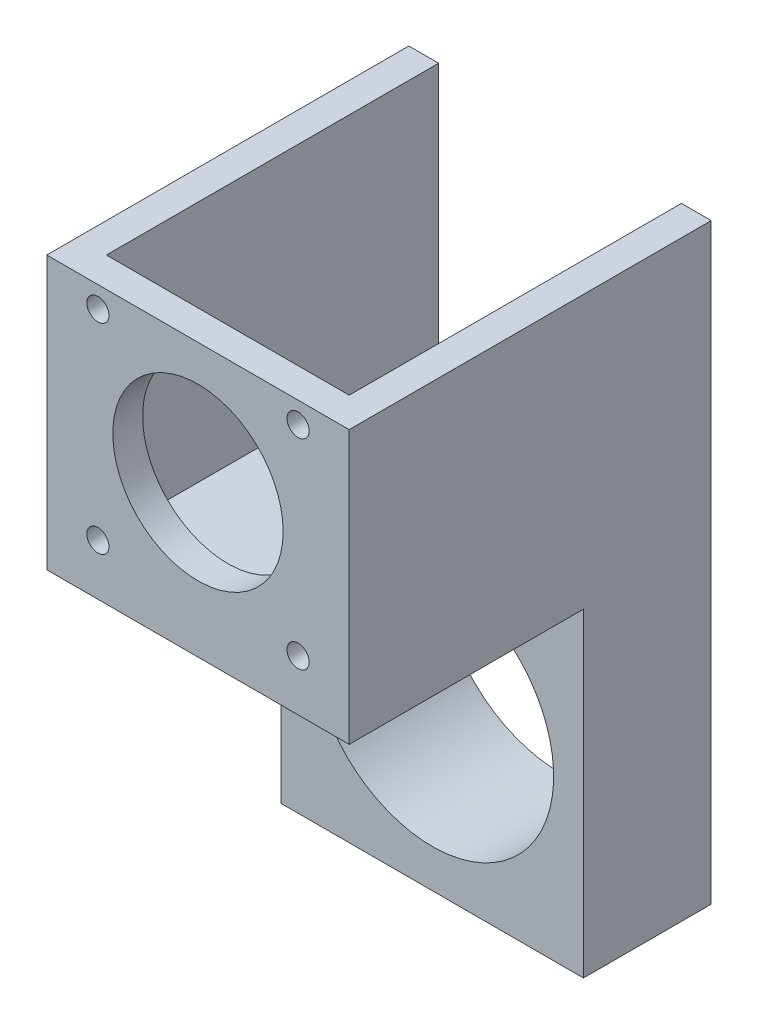
ISO-10303-21;
HEADER;
FILE_DESCRIPTION(('STEP AP214'),'2;1');
FILE_NAME('part.step','',(''),(''),'','','');
FILE_SCHEMA(('AUTOMOTIVE_DESIGN { 1 0 10303 214 1 1 1 1 }'));
ENDSEC;
DATA;
#1=APPLICATION_CONTEXT('core data for automotive mechanical design processes');
#2=APPLICATION_PROTOCOL_DEFINITION('international standard','automotive_design',2000,#1);
#3=PRODUCT_CONTEXT('',#1,'mechanical');
#4=PRODUCT('Part','Part','',(#3));
#5=PRODUCT_RELATED_PRODUCT_CATEGORY('part','',(#4));
#6=PRODUCT_DEFINITION_FORMATION('','',#4);
#7=PRODUCT_DEFINITION_CONTEXT('part definition',#1,'design');
#8=PRODUCT_DEFINITION('design','',#6,#7);
#9=PRODUCT_DEFINITION_SHAPE('','',#8);
#10=(LENGTH_UNIT() NAMED_UNIT(*) SI_UNIT(.MILLI.,.METRE.));
#11=(NAMED_UNIT(*) PLANE_ANGLE_UNIT() SI_UNIT($,.RADIAN.));
#12=(NAMED_UNIT(*) SI_UNIT($,.STERADIAN.) SOLID_ANGLE_UNIT());
#13=UNCERTAINTY_MEASURE_WITH_UNIT(LENGTH_MEASURE(1.E-05),#10,'distance_accuracy_value','');
#14=(GEOMETRIC_REPRESENTATION_CONTEXT(3) GLOBAL_UNCERTAINTY_ASSIGNED_CONTEXT((#13)) GLOBAL_UNIT_ASSIGNED_CONTEXT((#10,
#11,#12)) REPRESENTATION_CONTEXT('',''));
#15=CARTESIAN_POINT('',(0.,0.,0.));
#16=DIRECTION('',(0.,0.,1.));
#17=DIRECTION('',(1.,0.,0.));
#18=AXIS2_PLACEMENT_3D('',#15,#16,#17);
#19=CARTESIAN_POINT('',(0.,0.99999999999996,-68.));
#20=DIRECTION('',(0.,-1.,0.));
#21=DIRECTION('',(0.,0.,-1.));
#22=AXIS2_PLACEMENT_3D('',#19,#20,#21);
#23=PLANE('',#22);
#24=DIRECTION('',(0.,0.,1.));
#25=VECTOR('',#24,1.);
#26=CARTESIAN_POINT('',(-88.297129583773,0.99999999999996,-68.));
#27=LINE('',#26,#25);
#28=CARTESIAN_POINT('',(-88.297129583773,0.99999999999996,-48.));
#29=VERTEX_POINT('',#28);
#30=CARTESIAN_POINT('',(-88.297129583773,0.99999999999996,7.));
#31=VERTEX_POINT('',#30);
#32=EDGE_CURVE('E54',#29,#31,#27,.T.);
#33=ORIENTED_EDGE('',*,*,#32,.F.);
#34=DIRECTION('',(1.,0.,0.));
#35=VECTOR('',#34,1.);
#36=CARTESIAN_POINT('',(0.,0.99999999999996,-48.));
#37=LINE('',#36,#35);
#38=CARTESIAN_POINT('',(-17.297129583773,0.99999999999996,-48.));
#39=VERTEX_POINT('',#38);
#40=EDGE_CURVE('E49',#29,#39,#37,.T.);
#41=ORIENTED_EDGE('',*,*,#40,.T.);
#42=DIRECTION('',(0.,0.,1.));
#43=VECTOR('',#42,1.);
#44=CARTESIAN_POINT('',(-17.297129583773,0.99999999999996,-68.));
#45=LINE('',#44,#43);
#46=CARTESIAN_POINT('',(-17.297129583773,0.99999999999996,7.));
#47=VERTEX_POINT('',#46);
#48=EDGE_CURVE('E180',#39,#47,#45,.T.);
#49=ORIENTED_EDGE('',*,*,#48,.T.);
#50=DIRECTION('',(1.,0.,0.));
#51=VECTOR('',#50,1.);
#52=CARTESIAN_POINT('',(0.,0.99999999999996,7.));
#53=LINE('',#52,#51);
#54=EDGE_CURVE('E173',#31,#47,#53,.T.);
#55=ORIENTED_EDGE('',*,*,#54,.F.);
#56=EDGE_LOOP('',(#33,#41,#49,#55));
#57=FACE_BOUND('',#56,.T.);
#58=ADVANCED_FACE('F33',(#57),#23,.T.);
#59=CARTESIAN_POINT('',(0.,0.,7.));
#60=DIRECTION('',(0.,0.,1.));
#61=DIRECTION('',(1.,0.,0.));
#62=AXIS2_PLACEMENT_3D('',#59,#60,#61);
#63=PLANE('',#62);
#64=CARTESIAN_POINT('',(-52.7971295837729,36.5000000000001,7.));
#65=DIRECTION('',(0.,0.,1.));
#66=DIRECTION('',(1.,0.,0.));
#67=AXIS2_PLACEMENT_3D('',#64,#65,#66);
#68=CIRCLE('',#67,20.);
#69=CARTESIAN_POINT('',(-32.7971295837729,36.5000000000001,7.));
#70=VERTEX_POINT('',#69);
#71=EDGE_CURVE('E179',#70,#70,#68,.T.);
#72=ORIENTED_EDGE('',*,*,#71,.F.);
#73=EDGE_LOOP('',(#72));
#74=FACE_BOUND('',#73,.T.);
#75=CARTESIAN_POINT('',(-29.297129583773,60.,7.));
#76=DIRECTION('',(0.,0.,1.));
#77=DIRECTION('',(1.,0.,0.));
#78=AXIS2_PLACEMENT_3D('',#75,#76,#77);
#79=CIRCLE('',#78,2.60000000002528);
#80=CARTESIAN_POINT('',(-26.6971295837477,60.,7.));
#81=VERTEX_POINT('',#80);
#82=EDGE_CURVE('E202',#81,#81,#79,.T.);
#83=ORIENTED_EDGE('',*,*,#82,.F.);
#84=EDGE_LOOP('',(#83));
#85=FACE_BOUND('',#84,.T.);
#86=CARTESIAN_POINT('',(-76.2971295837732,13.0000000000002,7.));
#87=DIRECTION('',(0.,0.,1.));
#88=DIRECTION('',(1.,0.,0.));
#89=AXIS2_PLACEMENT_3D('',#86,#87,#88);
#90=CIRCLE('',#89,2.60000000001845);
#91=CARTESIAN_POINT('',(-73.6971295837547,13.0000000000002,7.));
#92=VERTEX_POINT('',#91);
#93=EDGE_CURVE('E214',#92,#92,#90,.T.);
#94=ORIENTED_EDGE('',*,*,#93,.F.);
#95=EDGE_LOOP('',(#94));
#96=FACE_BOUND('',#95,.T.);
#97=DIRECTION('',(-1.,0.,0.));
#98=VECTOR('',#97,1.);
#99=CARTESIAN_POINT('',(-24.297129583773,65.,7.));
#100=LINE('',#99,#98);
#101=CARTESIAN_POINT('',(-17.297129583773,65.,7.));
#102=VERTEX_POINT('',#101);
#103=CARTESIAN_POINT('',(-88.297129583773,65.,7.));
#104=VERTEX_POINT('',#103);
#105=EDGE_CURVE('E11',#102,#104,#100,.T.);
#106=ORIENTED_EDGE('',*,*,#105,.T.);
#107=DIRECTION('',(0.,-1.,0.));
#108=VECTOR('',#107,1.);
#109=CARTESIAN_POINT('',(-88.297129583773,0.,7.));
#110=LINE('',#109,#108);
#111=EDGE_CURVE('E170',#104,#31,#110,.T.);
#112=ORIENTED_EDGE('',*,*,#111,.T.);
#113=ORIENTED_EDGE('',*,*,#54,.T.);
#114=DIRECTION('',(0.,1.,0.));
#115=VECTOR('',#114,1.);
#116=CARTESIAN_POINT('',(-17.297129583773,0.,7.));
#117=LINE('',#116,#115);
#118=EDGE_CURVE('E120',#47,#102,#117,.T.);
#119=ORIENTED_EDGE('',*,*,#118,.T.);
#120=EDGE_LOOP('',(#106,#112,#113,#119));
#121=FACE_BOUND('',#120,.T.);
#122=CARTESIAN_POINT('',(-29.2971295837731,12.9999999999999,7.));
#123=DIRECTION('',(0.,0.,1.));
#124=DIRECTION('',(1.,0.,0.));
#125=AXIS2_PLACEMENT_3D('',#122,#123,#124);
#126=CIRCLE('',#125,2.59999999999688);
#127=CARTESIAN_POINT('',(-26.6971295837762,12.9999999999999,7.));
#128=VERTEX_POINT('',#127);
#129=EDGE_CURVE('E208',#128,#128,#126,.T.);
#130=ORIENTED_EDGE('',*,*,#129,.F.);
#131=EDGE_LOOP('',(#130));
#132=FACE_BOUND('',#131,.T.);
#133=CARTESIAN_POINT('',(-76.2971295837728,60.0000000000002,7.));
#134=DIRECTION('',(0.,0.,1.));
#135=DIRECTION('',(1.,0.,0.));
#136=AXIS2_PLACEMENT_3D('',#133,#134,#135);
#137=CIRCLE('',#136,2.5999999999579);
#138=CARTESIAN_POINT('',(-73.6971295838149,60.0000000000002,7.));
#139=VERTEX_POINT('',#138);
#140=EDGE_CURVE('E196',#139,#139,#137,.T.);
#141=ORIENTED_EDGE('',*,*,#140,.F.);
#142=EDGE_LOOP('',(#141));
#143=FACE_BOUND('',#142,.T.);
#144=ADVANCED_FACE('F248',(#74,#85,#96,#121,#132,#143),#63,.T.);
#145=CARTESIAN_POINT('',(0.,0.,0.));
#146=DIRECTION('',(0.,0.,1.));
#147=DIRECTION('',(1.,0.,0.));
#148=AXIS2_PLACEMENT_3D('',#145,#146,#147);
#149=PLANE('',#148);
#150=CARTESIAN_POINT('',(-52.7971295837729,36.5000000000001,0.));
#151=DIRECTION('',(0.,0.,1.));
#152=DIRECTION('',(1.,0.,0.));
#153=AXIS2_PLACEMENT_3D('',#150,#151,#152);
#154=CIRCLE('',#153,20.);
#155=CARTESIAN_POINT('',(-32.7971295837729,36.5000000000001,0.));
#156=VERTEX_POINT('',#155);
#157=EDGE_CURVE('E190',#156,#156,#154,.T.);
#158=ORIENTED_EDGE('',*,*,#157,.T.);
#159=EDGE_LOOP('',(#158));
#160=FACE_BOUND('',#159,.T.);
#161=DIRECTION('',(0.,-1.,0.));
#162=VECTOR('',#161,1.);
#163=CARTESIAN_POINT('',(-81.297129583773,25.5000000000003,0.));
#164=LINE('',#163,#162);
#165=CARTESIAN_POINT('',(-81.297129583773,65.,0.));
#166=VERTEX_POINT('',#165);
#167=CARTESIAN_POINT('',(-81.297129583773,7.99999999999996,0.));
#168=VERTEX_POINT('',#167);
#169=EDGE_CURVE('E217',#166,#168,#164,.T.);
#170=ORIENTED_EDGE('',*,*,#169,.F.);
#171=DIRECTION('',(-1.,0.,0.));
#172=VECTOR('',#171,1.);
#173=CARTESIAN_POINT('',(-63.797129583773,65.,0.));
#174=LINE('',#173,#172);
#175=CARTESIAN_POINT('',(-24.297129583773,65.,0.));
#176=VERTEX_POINT('',#175);
#177=EDGE_CURVE('E37',#176,#166,#174,.T.);
#178=ORIENTED_EDGE('',*,*,#177,.F.);
#179=DIRECTION('',(0.,1.,0.));
#180=VECTOR('',#179,1.);
#181=CARTESIAN_POINT('',(-24.297129583773,47.4999999999999,0.));
#182=LINE('',#181,#180);
#183=CARTESIAN_POINT('',(-24.297129583773,7.99999999999998,0.));
#184=VERTEX_POINT('',#183);
#185=EDGE_CURVE('E115',#184,#176,#182,.T.);
#186=ORIENTED_EDGE('',*,*,#185,.F.);
#187=DIRECTION('',(1.,0.,0.));
#188=VECTOR('',#187,1.);
#189=CARTESIAN_POINT('',(-41.7971295837732,7.99999999999998,0.));
#190=LINE('',#189,#188);
#191=EDGE_CURVE('E222',#168,#184,#190,.T.);
#192=ORIENTED_EDGE('',*,*,#191,.F.);
#193=EDGE_LOOP('',(#170,#178,#186,#192));
#194=FACE_BOUND('',#193,.T.);
#195=CARTESIAN_POINT('',(-76.2971295837732,13.0000000000002,0.));
#196=DIRECTION('',(0.,0.,1.));
#197=DIRECTION('',(1.,0.,0.));
#198=AXIS2_PLACEMENT_3D('',#195,#196,#197);
#199=CIRCLE('',#198,2.60000000001845);
#200=CARTESIAN_POINT('',(-73.6971295837547,13.0000000000002,0.));
#201=VERTEX_POINT('',#200);
#202=EDGE_CURVE('E211',#201,#201,#199,.T.);
#203=ORIENTED_EDGE('',*,*,#202,.T.);
#204=EDGE_LOOP('',(#203));
#205=FACE_BOUND('',#204,.T.);
#206=CARTESIAN_POINT('',(-29.2971295837731,12.9999999999999,0.));
#207=DIRECTION('',(0.,0.,1.));
#208=DIRECTION('',(1.,0.,0.));
#209=AXIS2_PLACEMENT_3D('',#206,#207,#208);
#210=CIRCLE('',#209,2.59999999999688);
#211=CARTESIAN_POINT('',(-26.6971295837762,12.9999999999999,0.));
#212=VERTEX_POINT('',#211);
#213=EDGE_CURVE('E205',#212,#212,#210,.T.);
#214=ORIENTED_EDGE('',*,*,#213,.T.);
#215=EDGE_LOOP('',(#214));
#216=FACE_BOUND('',#215,.T.);
#217=CARTESIAN_POINT('',(-29.297129583773,60.,0.));
#218=DIRECTION('',(0.,0.,1.));
#219=DIRECTION('',(1.,0.,0.));
#220=AXIS2_PLACEMENT_3D('',#217,#218,#219);
#221=CIRCLE('',#220,2.60000000002528);
#222=CARTESIAN_POINT('',(-26.6971295837477,60.,0.));
#223=VERTEX_POINT('',#222);
#224=EDGE_CURVE('E199',#223,#223,#221,.T.);
#225=ORIENTED_EDGE('',*,*,#224,.T.);
#226=EDGE_LOOP('',(#225));
#227=FACE_BOUND('',#226,.T.);
#228=CARTESIAN_POINT('',(-76.2971295837728,60.0000000000002,0.));
#229=DIRECTION('',(0.,0.,1.));
#230=DIRECTION('',(1.,0.,0.));
#231=AXIS2_PLACEMENT_3D('',#228,#229,#230);
#232=CIRCLE('',#231,2.5999999999579);
#233=CARTESIAN_POINT('',(-73.6971295838149,60.0000000000002,0.));
#234=VERTEX_POINT('',#233);
#235=EDGE_CURVE('E193',#234,#234,#232,.T.);
#236=ORIENTED_EDGE('',*,*,#235,.T.);
#237=EDGE_LOOP('',(#236));
#238=FACE_BOUND('',#237,.T.);
#239=ADVANCED_FACE('F227',(#160,#194,#205,#216,#227,#238),#149,.F.);
#240=CARTESIAN_POINT('',(-63.797129583773,65.,7.));
#241=DIRECTION('',(0.,-1.,0.));
#242=DIRECTION('',(0.,0.,-1.));
#243=AXIS2_PLACEMENT_3D('',#240,#241,#242);
#244=PLANE('',#243);
#245=DIRECTION('',(0.,0.,1.));
#246=VECTOR('',#245,1.);
#247=CARTESIAN_POINT('',(-24.297129583773,65.,-68.));
#248=LINE('',#247,#246);
#249=CARTESIAN_POINT('',(-24.297129583773,65.,-78.));
#250=VERTEX_POINT('',#249);
#251=EDGE_CURVE('E109',#250,#176,#248,.T.);
#252=ORIENTED_EDGE('',*,*,#251,.T.);
#253=ORIENTED_EDGE('',*,*,#177,.T.);
#254=DIRECTION('',(0.,0.,1.));
#255=VECTOR('',#254,1.);
#256=CARTESIAN_POINT('',(-81.297129583773,65.,-68.));
#257=LINE('',#256,#255);
#258=CARTESIAN_POINT('',(-81.297129583773,65.,-78.));
#259=VERTEX_POINT('',#258);
#260=EDGE_CURVE('E185',#259,#166,#257,.T.);
#261=ORIENTED_EDGE('',*,*,#260,.F.);
#262=DIRECTION('',(1.,0.,0.));
#263=VECTOR('',#262,1.);
#264=CARTESIAN_POINT('',(-88.297129583773,65.,-78.));
#265=LINE('',#264,#263);
#266=CARTESIAN_POINT('',(-88.297129583773,65.,-78.));
#267=VERTEX_POINT('',#266);
#268=EDGE_CURVE('E149',#267,#259,#265,.T.);
#269=ORIENTED_EDGE('',*,*,#268,.F.);
#270=DIRECTION('',(0.,0.,1.));
#271=VECTOR('',#270,1.);
#272=CARTESIAN_POINT('',(-88.297129583773,65.,-68.));
#273=LINE('',#272,#271);
#274=EDGE_CURVE('E183',#267,#104,#273,.T.);
#275=ORIENTED_EDGE('',*,*,#274,.T.);
#276=ORIENTED_EDGE('',*,*,#105,.F.);
#277=DIRECTION('',(0.,0.,1.));
#278=VECTOR('',#277,1.);
#279=CARTESIAN_POINT('',(-17.297129583773,65.,-68.));
#280=LINE('',#279,#278);
#281=CARTESIAN_POINT('',(-17.297129583773,65.,-78.));
#282=VERTEX_POINT('',#281);
#283=EDGE_CURVE('E125',#282,#102,#280,.T.);
#284=ORIENTED_EDGE('',*,*,#283,.F.);
#285=DIRECTION('',(1.,0.,0.));
#286=VECTOR('',#285,1.);
#287=CARTESIAN_POINT('',(-24.297129583773,65.,-78.));
#288=LINE('',#287,#286);
#289=EDGE_CURVE('E123',#250,#282,#288,.T.);
#290=ORIENTED_EDGE('',*,*,#289,.F.);
#291=EDGE_LOOP('',(#252,#253,#261,#269,#275,#276,#284,#290));
#292=FACE_BOUND('',#291,.T.);
#293=ADVANCED_FACE('F35',(#292),#244,.F.);
#294=CARTESIAN_POINT('',(-76.2971295837732,13.0000000000002,7.));
#295=DIRECTION('',(0.,0.,-1.));
#296=DIRECTION('',(-1.,0.,0.));
#297=AXIS2_PLACEMENT_3D('',#294,#295,#296);
#298=CYLINDRICAL_SURFACE('',#297,2.60000000001845);
#299=ORIENTED_EDGE('',*,*,#93,.T.);
#300=EDGE_LOOP('',(#299));
#301=FACE_BOUND('',#300,.T.);
#302=ORIENTED_EDGE('',*,*,#202,.F.);
#303=EDGE_LOOP('',(#302));
#304=FACE_BOUND('',#303,.T.);
#305=ADVANCED_FACE('F298',(#301,#304),#298,.F.);
#306=CARTESIAN_POINT('',(-29.2971295837731,12.9999999999999,7.));
#307=DIRECTION('',(0.,0.,-1.));
#308=DIRECTION('',(-1.,0.,0.));
#309=AXIS2_PLACEMENT_3D('',#306,#307,#308);
#310=CYLINDRICAL_SURFACE('',#309,2.59999999999688);
#311=ORIENTED_EDGE('',*,*,#129,.T.);
#312=EDGE_LOOP('',(#311));
#313=FACE_BOUND('',#312,.T.);
#314=ORIENTED_EDGE('',*,*,#213,.F.);
#315=EDGE_LOOP('',(#314));
#316=FACE_BOUND('',#315,.T.);
#317=ADVANCED_FACE('F302',(#313,#316),#310,.F.);
#318=CARTESIAN_POINT('',(-29.297129583773,60.,7.));
#319=DIRECTION('',(0.,0.,-1.));
#320=DIRECTION('',(-1.,0.,0.));
#321=AXIS2_PLACEMENT_3D('',#318,#319,#320);
#322=CYLINDRICAL_SURFACE('',#321,2.60000000002528);
#323=ORIENTED_EDGE('',*,*,#82,.T.);
#324=EDGE_LOOP('',(#323));
#325=FACE_BOUND('',#324,.T.);
#326=ORIENTED_EDGE('',*,*,#224,.F.);
#327=EDGE_LOOP('',(#326));
#328=FACE_BOUND('',#327,.T.);
#329=ADVANCED_FACE('F289',(#325,#328),#322,.F.);
#330=CARTESIAN_POINT('',(-76.2971295837728,60.0000000000002,7.));
#331=DIRECTION('',(0.,0.,-1.));
#332=DIRECTION('',(-1.,0.,0.));
#333=AXIS2_PLACEMENT_3D('',#330,#331,#332);
#334=CYLINDRICAL_SURFACE('',#333,2.5999999999579);
#335=ORIENTED_EDGE('',*,*,#140,.T.);
#336=EDGE_LOOP('',(#335));
#337=FACE_BOUND('',#336,.T.);
#338=ORIENTED_EDGE('',*,*,#235,.F.);
#339=EDGE_LOOP('',(#338));
#340=FACE_BOUND('',#339,.T.);
#341=ADVANCED_FACE('F243',(#337,#340),#334,.F.);
#342=CARTESIAN_POINT('',(-52.7971295837729,36.5000000000001,0.));
#343=DIRECTION('',(0.,0.,1.));
#344=DIRECTION('',(1.,0.,0.));
#345=AXIS2_PLACEMENT_3D('',#342,#343,#344);
#346=CYLINDRICAL_SURFACE('',#345,20.);
#347=ORIENTED_EDGE('',*,*,#157,.F.);
#348=EDGE_LOOP('',(#347));
#349=FACE_BOUND('',#348,.T.);
#350=ORIENTED_EDGE('',*,*,#71,.T.);
#351=EDGE_LOOP('',(#350));
#352=FACE_BOUND('',#351,.T.);
#353=ADVANCED_FACE('F236',(#349,#352),#346,.F.);
#354=CARTESIAN_POINT('',(0.,7.99999999999996,-68.));
#355=DIRECTION('',(0.,-1.,0.));
#356=DIRECTION('',(0.,0.,-1.));
#357=AXIS2_PLACEMENT_3D('',#354,#355,#356);
#358=PLANE('',#357);
#359=DIRECTION('',(0.,0.,1.));
#360=VECTOR('',#359,1.);
#361=CARTESIAN_POINT('',(-81.297129583773,7.99999999999996,-68.));
#362=LINE('',#361,#360);
#363=CARTESIAN_POINT('',(-81.297129583773,7.99999999999996,-78.));
#364=VERTEX_POINT('',#363);
#365=EDGE_CURVE('E187',#364,#168,#362,.T.);
#366=ORIENTED_EDGE('',*,*,#365,.T.);
#367=ORIENTED_EDGE('',*,*,#191,.T.);
#368=DIRECTION('',(0.,0.,1.));
#369=VECTOR('',#368,1.);
#370=CARTESIAN_POINT('',(-24.297129583773,7.99999999999998,-68.));
#371=LINE('',#370,#369);
#372=CARTESIAN_POINT('',(-24.297129583773,7.99999999999998,-78.));
#373=VERTEX_POINT('',#372);
#374=EDGE_CURVE('E119',#373,#184,#371,.T.);
#375=ORIENTED_EDGE('',*,*,#374,.F.);
#376=DIRECTION('',(1.,0.,0.));
#377=VECTOR('',#376,1.);
#378=CARTESIAN_POINT('',(-81.297129583773,7.99999999999996,-78.));
#379=LINE('',#378,#377);
#380=EDGE_CURVE('E136',#364,#373,#379,.T.);
#381=ORIENTED_EDGE('',*,*,#380,.F.);
#382=EDGE_LOOP('',(#366,#367,#375,#381));
#383=FACE_BOUND('',#382,.T.);
#384=ADVANCED_FACE('F234',(#383),#358,.F.);
#385=CARTESIAN_POINT('',(-81.297129583773,0.,-68.));
#386=DIRECTION('',(-1.,0.,0.));
#387=DIRECTION('',(0.,0.,1.));
#388=AXIS2_PLACEMENT_3D('',#385,#386,#387);
#389=PLANE('',#388);
#390=ORIENTED_EDGE('',*,*,#260,.T.);
#391=ORIENTED_EDGE('',*,*,#169,.T.);
#392=ORIENTED_EDGE('',*,*,#365,.F.);
#393=DIRECTION('',(0.,-1.,0.));
#394=VECTOR('',#393,1.);
#395=CARTESIAN_POINT('',(-81.297129583773,65.,-78.));
#396=LINE('',#395,#394);
#397=EDGE_CURVE('E152',#259,#364,#396,.T.);
#398=ORIENTED_EDGE('',*,*,#397,.F.);
#399=EDGE_LOOP('',(#390,#391,#392,#398));
#400=FACE_BOUND('',#399,.T.);
#401=ADVANCED_FACE('F231',(#400),#389,.F.);
#402=CARTESIAN_POINT('',(-24.297129583773,0.,-68.));
#403=DIRECTION('',(1.,0.,0.));
#404=DIRECTION('',(0.,0.,-1.));
#405=AXIS2_PLACEMENT_3D('',#402,#403,#404);
#406=PLANE('',#405);
#407=ORIENTED_EDGE('',*,*,#374,.T.);
#408=ORIENTED_EDGE('',*,*,#185,.T.);
#409=ORIENTED_EDGE('',*,*,#251,.F.);
#410=DIRECTION('',(0.,1.,0.));
#411=VECTOR('',#410,1.);
#412=CARTESIAN_POINT('',(-24.297129583773,7.99999999999998,-78.));
#413=LINE('',#412,#411);
#414=EDGE_CURVE('E113',#373,#250,#413,.T.);
#415=ORIENTED_EDGE('',*,*,#414,.F.);
#416=EDGE_LOOP('',(#407,#408,#409,#415));
#417=FACE_BOUND('',#416,.T.);
#418=ADVANCED_FACE('F111',(#417),#406,.F.);
#419=CARTESIAN_POINT('',(-17.297129583773,0.,-68.));
#420=DIRECTION('',(1.,0.,0.));
#421=DIRECTION('',(0.,0.,-1.));
#422=AXIS2_PLACEMENT_3D('',#419,#420,#421);
#423=PLANE('',#422);
#424=ORIENTED_EDGE('',*,*,#283,.T.);
#425=ORIENTED_EDGE('',*,*,#118,.F.);
#426=ORIENTED_EDGE('',*,*,#48,.F.);
#427=DIRECTION('',(0.,-1.,0.));
#428=VECTOR('',#427,1.);
#429=CARTESIAN_POINT('',(-17.297129583773,65.,-48.));
#430=LINE('',#429,#428);
#431=CARTESIAN_POINT('',(-17.297129583773,-74.,-48.));
#432=VERTEX_POINT('',#431);
#433=EDGE_CURVE('E158',#39,#432,#430,.T.);
#434=ORIENTED_EDGE('',*,*,#433,.T.);
#435=DIRECTION('',(0.,0.,-1.));
#436=VECTOR('',#435,1.);
#437=CARTESIAN_POINT('',(-17.297129583773,-74.,-48.));
#438=LINE('',#437,#436);
#439=CARTESIAN_POINT('',(-17.297129583773,-74.,-78.));
#440=VERTEX_POINT('',#439);
#441=EDGE_CURVE('E165',#432,#440,#438,.T.);
#442=ORIENTED_EDGE('',*,*,#441,.T.);
#443=DIRECTION('',(0.,-1.,0.));
#444=VECTOR('',#443,1.);
#445=CARTESIAN_POINT('',(-17.297129583773,65.,-78.));
#446=LINE('',#445,#444);
#447=EDGE_CURVE('E129',#282,#440,#446,.T.);
#448=ORIENTED_EDGE('',*,*,#447,.F.);
#449=EDGE_LOOP('',(#424,#425,#426,#434,#442,#448));
#450=FACE_BOUND('',#449,.T.);
#451=ADVANCED_FACE('F257',(#450),#423,.T.);
#452=CARTESIAN_POINT('',(-88.297129583773,0.,-68.));
#453=DIRECTION('',(-1.,0.,0.));
#454=DIRECTION('',(0.,0.,1.));
#455=AXIS2_PLACEMENT_3D('',#452,#453,#454);
#456=PLANE('',#455);
#457=DIRECTION('',(0.,1.,0.));
#458=VECTOR('',#457,1.);
#459=CARTESIAN_POINT('',(-88.297129583773,0.99999999999996,-48.));
#460=LINE('',#459,#458);
#461=CARTESIAN_POINT('',(-88.297129583773,-74.,-48.));
#462=VERTEX_POINT('',#461);
#463=EDGE_CURVE('E162',#462,#29,#460,.T.);
#464=ORIENTED_EDGE('',*,*,#463,.T.);
#465=ORIENTED_EDGE('',*,*,#32,.T.);
#466=ORIENTED_EDGE('',*,*,#111,.F.);
#467=ORIENTED_EDGE('',*,*,#274,.F.);
#468=DIRECTION('',(0.,1.,0.));
#469=VECTOR('',#468,1.);
#470=CARTESIAN_POINT('',(-88.297129583773,0.99999999999996,-78.));
#471=LINE('',#470,#469);
#472=CARTESIAN_POINT('',(-88.297129583773,-74.,-78.));
#473=VERTEX_POINT('',#472);
#474=EDGE_CURVE('E146',#473,#267,#471,.T.);
#475=ORIENTED_EDGE('',*,*,#474,.F.);
#476=DIRECTION('',(0.,0.,-1.));
#477=VECTOR('',#476,1.);
#478=CARTESIAN_POINT('',(-88.297129583773,-74.,-48.));
#479=LINE('',#478,#477);
#480=EDGE_CURVE('E166',#462,#473,#479,.T.);
#481=ORIENTED_EDGE('',*,*,#480,.F.);
#482=EDGE_LOOP('',(#464,#465,#466,#467,#475,#481));
#483=FACE_BOUND('',#482,.T.);
#484=ADVANCED_FACE('F259',(#483),#456,.T.);
#485=CARTESIAN_POINT('',(-52.797129583773,-74.,-48.));
#486=DIRECTION('',(0.,-1.,0.));
#487=DIRECTION('',(0.,0.,-1.));
#488=AXIS2_PLACEMENT_3D('',#485,#486,#487);
#489=PLANE('',#488);
#490=ORIENTED_EDGE('',*,*,#480,.T.);
#491=DIRECTION('',(-1.,0.,0.));
#492=VECTOR('',#491,1.);
#493=CARTESIAN_POINT('',(-52.797129583773,-74.,-78.));
#494=LINE('',#493,#492);
#495=EDGE_CURVE('E143',#440,#473,#494,.T.);
#496=ORIENTED_EDGE('',*,*,#495,.F.);
#497=ORIENTED_EDGE('',*,*,#441,.F.);
#498=DIRECTION('',(-1.,0.,0.));
#499=VECTOR('',#498,1.);
#500=CARTESIAN_POINT('',(-52.797129583773,-74.,-48.));
#501=LINE('',#500,#499);
#502=EDGE_CURVE('E160',#432,#462,#501,.T.);
#503=ORIENTED_EDGE('',*,*,#502,.T.);
#504=EDGE_LOOP('',(#490,#496,#497,#503));
#505=FACE_BOUND('',#504,.T.);
#506=ADVANCED_FACE('F261',(#505),#489,.T.);
#507=CARTESIAN_POINT('',(0.,0.,-48.));
#508=DIRECTION('',(0.,0.,-1.));
#509=DIRECTION('',(-1.,0.,0.));
#510=AXIS2_PLACEMENT_3D('',#507,#508,#509);
#511=PLANE('',#510);
#512=ORIENTED_EDGE('',*,*,#40,.F.);
#513=ORIENTED_EDGE('',*,*,#463,.F.);
#514=ORIENTED_EDGE('',*,*,#502,.F.);
#515=ORIENTED_EDGE('',*,*,#433,.F.);
#516=EDGE_LOOP('',(#512,#513,#514,#515));
#517=FACE_BOUND('',#516,.T.);
#518=CARTESIAN_POINT('',(-52.797129583773,-36.5,-48.));
#519=DIRECTION('',(0.,0.,-1.));
#520=DIRECTION('',(-1.,0.,0.));
#521=AXIS2_PLACEMENT_3D('',#518,#519,#520);
#522=CIRCLE('',#521,28.5);
#523=CARTESIAN_POINT('',(-81.297129583773,-36.5,-48.));
#524=VERTEX_POINT('',#523);
#525=EDGE_CURVE('E155',#524,#524,#522,.T.);
#526=ORIENTED_EDGE('',*,*,#525,.T.);
#527=EDGE_LOOP('',(#526));
#528=FACE_BOUND('',#527,.T.);
#529=ADVANCED_FACE('F267',(#517,#528),#511,.F.);
#530=CARTESIAN_POINT('',(-52.797129583773,-36.5,-48.));
#531=DIRECTION('',(0.,0.,-1.));
#532=DIRECTION('',(-1.,0.,0.));
#533=AXIS2_PLACEMENT_3D('',#530,#531,#532);
#534=CYLINDRICAL_SURFACE('',#533,28.5);
#535=ORIENTED_EDGE('',*,*,#525,.F.);
#536=EDGE_LOOP('',(#535));
#537=FACE_BOUND('',#536,.T.);
#538=CARTESIAN_POINT('',(-52.797129583773,-36.5,-78.));
#539=DIRECTION('',(0.,0.,-1.));
#540=DIRECTION('',(-1.,0.,0.));
#541=AXIS2_PLACEMENT_3D('',#538,#539,#540);
#542=CIRCLE('',#541,28.5);
#543=CARTESIAN_POINT('',(-81.297129583773,-36.5,-78.));
#544=VERTEX_POINT('',#543);
#545=EDGE_CURVE('E137',#544,#544,#542,.T.);
#546=ORIENTED_EDGE('',*,*,#545,.T.);
#547=EDGE_LOOP('',(#546));
#548=FACE_BOUND('',#547,.T.);
#549=ADVANCED_FACE('F340',(#537,#548),#534,.F.);
#550=CARTESIAN_POINT('',(0.,0.,-78.));
#551=DIRECTION('',(0.,0.,-1.));
#552=DIRECTION('',(-1.,0.,0.));
#553=AXIS2_PLACEMENT_3D('',#550,#551,#552);
#554=PLANE('',#553);
#555=ORIENTED_EDGE('',*,*,#414,.T.);
#556=ORIENTED_EDGE('',*,*,#289,.T.);
#557=ORIENTED_EDGE('',*,*,#447,.T.);
#558=ORIENTED_EDGE('',*,*,#495,.T.);
#559=ORIENTED_EDGE('',*,*,#474,.T.);
#560=ORIENTED_EDGE('',*,*,#268,.T.);
#561=ORIENTED_EDGE('',*,*,#397,.T.);
#562=ORIENTED_EDGE('',*,*,#380,.T.);
#563=EDGE_LOOP('',(#555,#556,#557,#558,#559,#560,#561,#562));
#564=FACE_BOUND('',#563,.T.);
#565=ORIENTED_EDGE('',*,*,#545,.F.);
#566=EDGE_LOOP('',(#565));
#567=FACE_BOUND('',#566,.T.);
#568=ADVANCED_FACE('F132',(#564,#567),#554,.T.);
#569=CLOSED_SHELL('',(#58,#144,#239,#293,#305,#317,#329,#341,#353,#384,#401,#418,#451,#484,#506,
#529,#549,#568));
#570=MANIFOLD_SOLID_BREP('B2',#569);
#571=ADVANCED_BREP_SHAPE_REPRESENTATION('',(#18,#570),#14);
#572=SHAPE_DEFINITION_REPRESENTATION(#9,#571);
ENDSEC;
END-ISO-10303-21;
